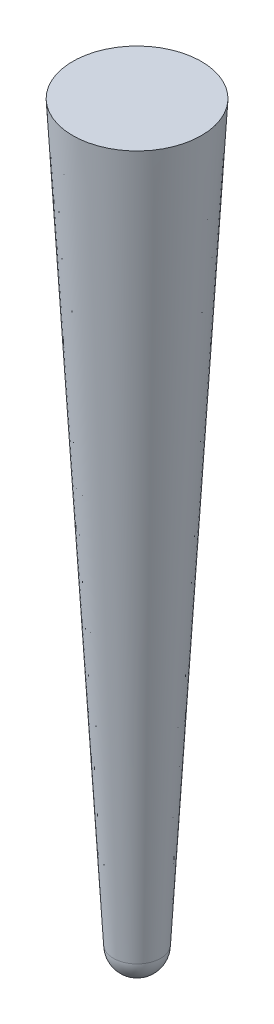
ISO-10303-21;
HEADER;
FILE_DESCRIPTION(('STEP AP214'),'2;1');
FILE_NAME('part.step','',(''),(''),'','','');
FILE_SCHEMA(('AUTOMOTIVE_DESIGN { 1 0 10303 214 1 1 1 1 }'));
ENDSEC;
DATA;
#1=APPLICATION_CONTEXT('core data for automotive mechanical design processes');
#2=APPLICATION_PROTOCOL_DEFINITION('international standard','automotive_design',2000,#1);
#3=PRODUCT_CONTEXT('',#1,'mechanical');
#4=PRODUCT('Part','Part','',(#3));
#5=PRODUCT_RELATED_PRODUCT_CATEGORY('part','',(#4));
#6=PRODUCT_DEFINITION_FORMATION('','',#4);
#7=PRODUCT_DEFINITION_CONTEXT('part definition',#1,'design');
#8=PRODUCT_DEFINITION('design','',#6,#7);
#9=PRODUCT_DEFINITION_SHAPE('','',#8);
#10=(LENGTH_UNIT() NAMED_UNIT(*) SI_UNIT(.MILLI.,.METRE.));
#11=(NAMED_UNIT(*) PLANE_ANGLE_UNIT() SI_UNIT($,.RADIAN.));
#12=(NAMED_UNIT(*) SI_UNIT($,.STERADIAN.) SOLID_ANGLE_UNIT());
#13=UNCERTAINTY_MEASURE_WITH_UNIT(LENGTH_MEASURE(1.E-05),#10,'distance_accuracy_value','');
#14=(GEOMETRIC_REPRESENTATION_CONTEXT(3) GLOBAL_UNCERTAINTY_ASSIGNED_CONTEXT((#13)) GLOBAL_UNIT_ASSIGNED_CONTEXT((#10,
#11,#12)) REPRESENTATION_CONTEXT('',''));
#15=CARTESIAN_POINT('',(0.,0.,0.));
#16=DIRECTION('',(0.,0.,1.));
#17=DIRECTION('',(1.,0.,0.));
#18=AXIS2_PLACEMENT_3D('',#15,#16,#17);
#19=CARTESIAN_POINT('',(0.,-216.32969924812,0.));
#20=DIRECTION('',(0.,-1.,0.));
#21=DIRECTION('',(-1.,0.,0.));
#22=AXIS2_PLACEMENT_3D('',#19,#20,#21);
#23=SPHERICAL_SURFACE('',#22,7.9375);
#24=CARTESIAN_POINT('',(0.,-216.32969924812,0.));
#25=DIRECTION('',(0.,-1.,0.));
#26=DIRECTION('',(1.,0.,0.));
#27=AXIS2_PLACEMENT_3D('',#24,#25,#26);
#28=CIRCLE('',#27,7.9375);
#29=CARTESIAN_POINT('',(7.9375,-216.32969924812,0.));
#30=VERTEX_POINT('',#29);
#31=EDGE_CURVE('E10',#30,#30,#28,.T.);
#32=ORIENTED_EDGE('',*,*,#31,.T.);
#33=EDGE_LOOP('',(#32));
#34=FACE_BOUND('',#33,.T.);
#35=ADVANCED_FACE('F35',(#34),#23,.T.);
#36=CARTESIAN_POINT('',(0.,29.7328007518797,0.));
#37=DIRECTION('',(0.,1.,0.));
#38=DIRECTION('',(-1.,0.,0.));
#39=AXIS2_PLACEMENT_3D('',#36,#37,#38);
#40=CONICAL_SURFACE('',#39,21.59,0.0554270409422581);
#41=ORIENTED_EDGE('',*,*,#31,.F.);
#42=EDGE_LOOP('',(#41));
#43=FACE_BOUND('',#42,.T.);
#44=CARTESIAN_POINT('',(0.,29.7328007518797,0.));
#45=DIRECTION('',(0.,-1.,0.));
#46=DIRECTION('',(1.,0.,0.));
#47=AXIS2_PLACEMENT_3D('',#44,#45,#46);
#48=CIRCLE('',#47,21.59);
#49=CARTESIAN_POINT('',(21.59,29.7328007518797,0.));
#50=VERTEX_POINT('',#49);
#51=EDGE_CURVE('E41',#50,#50,#48,.T.);
#52=ORIENTED_EDGE('',*,*,#51,.T.);
#53=EDGE_LOOP('',(#52));
#54=FACE_BOUND('',#53,.T.);
#55=ADVANCED_FACE('F47',(#43,#54),#40,.T.);
#56=CARTESIAN_POINT('',(0.,29.7328007518797,0.));
#57=DIRECTION('',(0.,-1.,0.));
#58=DIRECTION('',(1.,0.,0.));
#59=AXIS2_PLACEMENT_3D('',#56,#57,#58);
#60=PLANE('',#59);
#61=ORIENTED_EDGE('',*,*,#51,.F.);
#62=EDGE_LOOP('',(#61));
#63=FACE_BOUND('',#62,.T.);
#64=ADVANCED_FACE('F49',(#63),#60,.F.);
#65=CLOSED_SHELL('',(#35,#55,#64));
#66=MANIFOLD_SOLID_BREP('B2',#65);
#67=ADVANCED_BREP_SHAPE_REPRESENTATION('',(#18,#66),#14);
#68=SHAPE_DEFINITION_REPRESENTATION(#9,#67);
ENDSEC;
END-ISO-10303-21;
